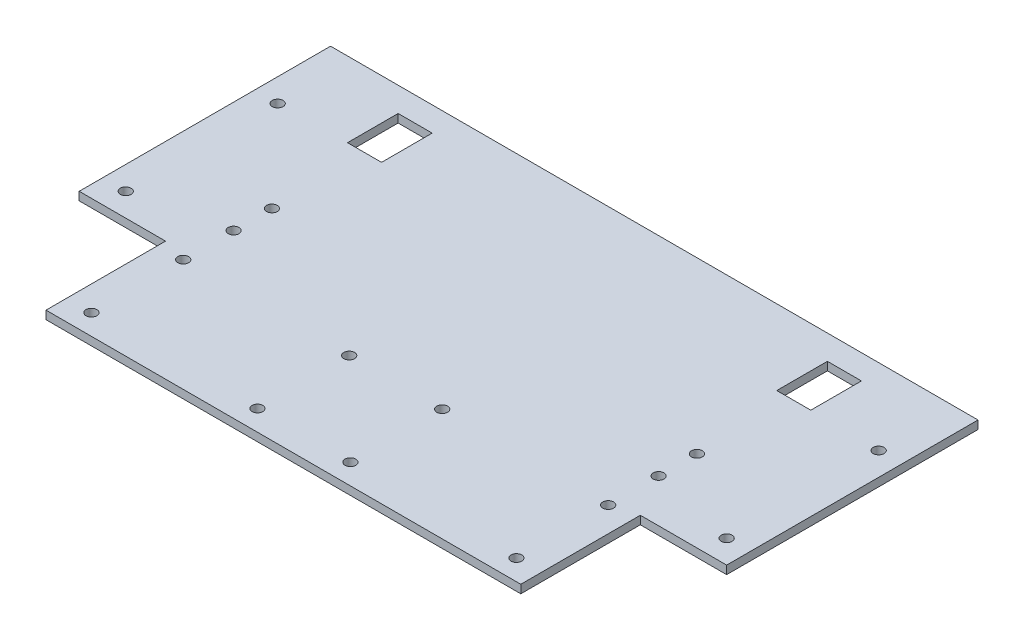
ISO-10303-21;
HEADER;
FILE_DESCRIPTION(('STEP AP214'),'2;1');
FILE_NAME('part.step','',(''),(''),'','','');
FILE_SCHEMA(('AUTOMOTIVE_DESIGN { 1 0 10303 214 1 1 1 1 }'));
ENDSEC;
DATA;
#1=APPLICATION_CONTEXT('core data for automotive mechanical design processes');
#2=APPLICATION_PROTOCOL_DEFINITION('international standard','automotive_design',2000,#1);
#3=PRODUCT_CONTEXT('',#1,'mechanical');
#4=PRODUCT('Part','Part','',(#3));
#5=PRODUCT_RELATED_PRODUCT_CATEGORY('part','',(#4));
#6=PRODUCT_DEFINITION_FORMATION('','',#4);
#7=PRODUCT_DEFINITION_CONTEXT('part definition',#1,'design');
#8=PRODUCT_DEFINITION('design','',#6,#7);
#9=PRODUCT_DEFINITION_SHAPE('','',#8);
#10=(LENGTH_UNIT() NAMED_UNIT(*) SI_UNIT(.MILLI.,.METRE.));
#11=(NAMED_UNIT(*) PLANE_ANGLE_UNIT() SI_UNIT($,.RADIAN.));
#12=(NAMED_UNIT(*) SI_UNIT($,.STERADIAN.) SOLID_ANGLE_UNIT());
#13=UNCERTAINTY_MEASURE_WITH_UNIT(LENGTH_MEASURE(1.E-05),#10,'distance_accuracy_value','');
#14=(GEOMETRIC_REPRESENTATION_CONTEXT(3) GLOBAL_UNCERTAINTY_ASSIGNED_CONTEXT((#13)) GLOBAL_UNIT_ASSIGNED_CONTEXT((#10,
#11,#12)) REPRESENTATION_CONTEXT('',''));
#15=CARTESIAN_POINT('',(0.,0.,0.));
#16=DIRECTION('',(0.,0.,1.));
#17=DIRECTION('',(1.,0.,0.));
#18=AXIS2_PLACEMENT_3D('',#15,#16,#17);
#19=CARTESIAN_POINT('',(-97.5,2.5,0.));
#20=DIRECTION('',(-1.,0.,0.));
#21=DIRECTION('',(0.,0.,1.));
#22=AXIS2_PLACEMENT_3D('',#19,#20,#21);
#23=PLANE('',#22);
#24=DIRECTION('',(0.,0.,-1.));
#25=VECTOR('',#24,1.);
#26=CARTESIAN_POINT('',(-97.5,0.,0.));
#27=LINE('',#26,#25);
#28=CARTESIAN_POINT('',(-97.5,0.,25.0000000000045));
#29=VERTEX_POINT('',#28);
#30=CARTESIAN_POINT('',(-97.5,0.,-50.6999999999954));
#31=VERTEX_POINT('',#30);
#32=EDGE_CURVE('E177',#29,#31,#27,.T.);
#33=ORIENTED_EDGE('',*,*,#32,.F.);
#34=DIRECTION('',(0.,-1.,0.));
#35=VECTOR('',#34,1.);
#36=CARTESIAN_POINT('',(-97.5,2.5,25.0000000000045));
#37=LINE('',#36,#35);
#38=CARTESIAN_POINT('',(-97.5,2.5,25.0000000000045));
#39=VERTEX_POINT('',#38);
#40=EDGE_CURVE('E11',#39,#29,#37,.T.);
#41=ORIENTED_EDGE('',*,*,#40,.F.);
#42=DIRECTION('',(0.,0.,-1.));
#43=VECTOR('',#42,1.);
#44=CARTESIAN_POINT('',(-97.5,2.5,0.));
#45=LINE('',#44,#43);
#46=CARTESIAN_POINT('',(-97.5,2.50000000000003,-50.6999999999954));
#47=VERTEX_POINT('',#46);
#48=EDGE_CURVE('E189',#39,#47,#45,.T.);
#49=ORIENTED_EDGE('',*,*,#48,.T.);
#50=DIRECTION('',(0.,-1.,0.));
#51=VECTOR('',#50,1.);
#52=CARTESIAN_POINT('',(-97.5,2.50000000000003,-50.6999999999954));
#53=LINE('',#52,#51);
#54=EDGE_CURVE('E159',#47,#31,#53,.T.);
#55=ORIENTED_EDGE('',*,*,#54,.T.);
#56=EDGE_LOOP('',(#33,#41,#49,#55));
#57=FACE_BOUND('',#56,.T.);
#58=ADVANCED_FACE('F35',(#57),#23,.T.);
#59=CARTESIAN_POINT('',(0.,2.5,25.0000000000045));
#60=DIRECTION('',(0.,0.,1.));
#61=DIRECTION('',(1.,0.,0.));
#62=AXIS2_PLACEMENT_3D('',#59,#60,#61);
#63=PLANE('',#62);
#64=DIRECTION('',(-1.,0.,0.));
#65=VECTOR('',#64,1.);
#66=CARTESIAN_POINT('',(0.,0.,25.0000000000045));
#67=LINE('',#66,#65);
#68=CARTESIAN_POINT('',(-71.5,0.,25.0000000000045));
#69=VERTEX_POINT('',#68);
#70=EDGE_CURVE('E180',#69,#29,#67,.T.);
#71=ORIENTED_EDGE('',*,*,#70,.F.);
#72=DIRECTION('',(0.,-1.,0.));
#73=VECTOR('',#72,1.);
#74=CARTESIAN_POINT('',(-71.5,2.5,25.0000000000045));
#75=LINE('',#74,#73);
#76=CARTESIAN_POINT('',(-71.5,2.5,25.0000000000045));
#77=VERTEX_POINT('',#76);
#78=EDGE_CURVE('E43',#77,#69,#75,.T.);
#79=ORIENTED_EDGE('',*,*,#78,.F.);
#80=DIRECTION('',(-1.,0.,0.));
#81=VECTOR('',#80,1.);
#82=CARTESIAN_POINT('',(0.,2.5,25.0000000000045));
#83=LINE('',#82,#81);
#84=EDGE_CURVE('E191',#77,#39,#83,.T.);
#85=ORIENTED_EDGE('',*,*,#84,.T.);
#86=ORIENTED_EDGE('',*,*,#40,.T.);
#87=EDGE_LOOP('',(#71,#79,#85,#86));
#88=FACE_BOUND('',#87,.T.);
#89=ADVANCED_FACE('F395',(#88),#63,.T.);
#90=CARTESIAN_POINT('',(-71.5,2.5,0.));
#91=DIRECTION('',(-1.,0.,0.));
#92=DIRECTION('',(0.,0.,1.));
#93=AXIS2_PLACEMENT_3D('',#90,#91,#92);
#94=PLANE('',#93);
#95=DIRECTION('',(0.,0.,-1.));
#96=VECTOR('',#95,1.);
#97=CARTESIAN_POINT('',(-71.5,0.,0.));
#98=LINE('',#97,#96);
#99=CARTESIAN_POINT('',(-71.5,0.,61.0000000000045));
#100=VERTEX_POINT('',#99);
#101=EDGE_CURVE('E213',#100,#69,#98,.T.);
#102=ORIENTED_EDGE('',*,*,#101,.F.);
#103=DIRECTION('',(0.,-1.,0.));
#104=VECTOR('',#103,1.);
#105=CARTESIAN_POINT('',(-71.5,2.5,61.0000000000045));
#106=LINE('',#105,#104);
#107=CARTESIAN_POINT('',(-71.5,2.5,61.0000000000045));
#108=VERTEX_POINT('',#107);
#109=EDGE_CURVE('E232',#108,#100,#106,.T.);
#110=ORIENTED_EDGE('',*,*,#109,.F.);
#111=DIRECTION('',(0.,0.,-1.));
#112=VECTOR('',#111,1.);
#113=CARTESIAN_POINT('',(-71.5,2.5,0.));
#114=LINE('',#113,#112);
#115=EDGE_CURVE('E195',#108,#77,#114,.T.);
#116=ORIENTED_EDGE('',*,*,#115,.T.);
#117=ORIENTED_EDGE('',*,*,#78,.T.);
#118=EDGE_LOOP('',(#102,#110,#116,#117));
#119=FACE_BOUND('',#118,.T.);
#120=ADVANCED_FACE('F392',(#119),#94,.T.);
#121=CARTESIAN_POINT('',(0.,2.5,61.0000000000045));
#122=DIRECTION('',(0.,0.,-1.));
#123=DIRECTION('',(-1.,0.,0.));
#124=AXIS2_PLACEMENT_3D('',#121,#122,#123);
#125=PLANE('',#124);
#126=DIRECTION('',(1.,0.,0.));
#127=VECTOR('',#126,1.);
#128=CARTESIAN_POINT('',(0.,0.,61.0000000000045));
#129=LINE('',#128,#127);
#130=CARTESIAN_POINT('',(71.5,0.,61.0000000000045));
#131=VERTEX_POINT('',#130);
#132=EDGE_CURVE('E216',#100,#131,#129,.T.);
#133=ORIENTED_EDGE('',*,*,#132,.T.);
#134=DIRECTION('',(0.,-1.,0.));
#135=VECTOR('',#134,1.);
#136=CARTESIAN_POINT('',(71.5,2.5,61.0000000000045));
#137=LINE('',#136,#135);
#138=CARTESIAN_POINT('',(71.5,2.5,61.0000000000045));
#139=VERTEX_POINT('',#138);
#140=EDGE_CURVE('E229',#139,#131,#137,.T.);
#141=ORIENTED_EDGE('',*,*,#140,.F.);
#142=DIRECTION('',(1.,0.,0.));
#143=VECTOR('',#142,1.);
#144=CARTESIAN_POINT('',(0.,2.5,61.0000000000045));
#145=LINE('',#144,#143);
#146=EDGE_CURVE('E198',#108,#139,#145,.T.);
#147=ORIENTED_EDGE('',*,*,#146,.F.);
#148=ORIENTED_EDGE('',*,*,#109,.T.);
#149=EDGE_LOOP('',(#133,#141,#147,#148));
#150=FACE_BOUND('',#149,.T.);
#151=ADVANCED_FACE('F389',(#150),#125,.F.);
#152=CARTESIAN_POINT('',(71.5,2.5,0.));
#153=DIRECTION('',(-1.,0.,0.));
#154=DIRECTION('',(0.,0.,1.));
#155=AXIS2_PLACEMENT_3D('',#152,#153,#154);
#156=PLANE('',#155);
#157=DIRECTION('',(0.,0.,-1.));
#158=VECTOR('',#157,1.);
#159=CARTESIAN_POINT('',(71.5,0.,0.));
#160=LINE('',#159,#158);
#161=CARTESIAN_POINT('',(71.5,0.,25.0000000000045));
#162=VERTEX_POINT('',#161);
#163=EDGE_CURVE('E218',#131,#162,#160,.T.);
#164=ORIENTED_EDGE('',*,*,#163,.T.);
#165=DIRECTION('',(0.,-1.,0.));
#166=VECTOR('',#165,1.);
#167=CARTESIAN_POINT('',(71.5,2.5,25.0000000000045));
#168=LINE('',#167,#166);
#169=CARTESIAN_POINT('',(71.5,2.5,25.0000000000045));
#170=VERTEX_POINT('',#169);
#171=EDGE_CURVE('E226',#170,#162,#168,.T.);
#172=ORIENTED_EDGE('',*,*,#171,.F.);
#173=DIRECTION('',(0.,0.,-1.));
#174=VECTOR('',#173,1.);
#175=CARTESIAN_POINT('',(71.5,2.5,0.));
#176=LINE('',#175,#174);
#177=EDGE_CURVE('E200',#139,#170,#176,.T.);
#178=ORIENTED_EDGE('',*,*,#177,.F.);
#179=ORIENTED_EDGE('',*,*,#140,.T.);
#180=EDGE_LOOP('',(#164,#172,#178,#179));
#181=FACE_BOUND('',#180,.T.);
#182=ADVANCED_FACE('F385',(#181),#156,.F.);
#183=CARTESIAN_POINT('',(0.,2.5,25.0000000000045));
#184=DIRECTION('',(0.,0.,-1.));
#185=DIRECTION('',(-1.,0.,0.));
#186=AXIS2_PLACEMENT_3D('',#183,#184,#185);
#187=PLANE('',#186);
#188=DIRECTION('',(1.,0.,0.));
#189=VECTOR('',#188,1.);
#190=CARTESIAN_POINT('',(0.,0.,25.0000000000045));
#191=LINE('',#190,#189);
#192=CARTESIAN_POINT('',(97.5,0.,25.0000000000045));
#193=VERTEX_POINT('',#192);
#194=EDGE_CURVE('E170',#162,#193,#191,.T.);
#195=ORIENTED_EDGE('',*,*,#194,.T.);
#196=DIRECTION('',(0.,-1.,0.));
#197=VECTOR('',#196,1.);
#198=CARTESIAN_POINT('',(97.5,2.5,25.0000000000045));
#199=LINE('',#198,#197);
#200=CARTESIAN_POINT('',(97.5,2.5,25.0000000000045));
#201=VERTEX_POINT('',#200);
#202=EDGE_CURVE('E166',#201,#193,#199,.T.);
#203=ORIENTED_EDGE('',*,*,#202,.F.);
#204=DIRECTION('',(1.,0.,0.));
#205=VECTOR('',#204,1.);
#206=CARTESIAN_POINT('',(0.,2.5,25.0000000000045));
#207=LINE('',#206,#205);
#208=EDGE_CURVE('E202',#170,#201,#207,.T.);
#209=ORIENTED_EDGE('',*,*,#208,.F.);
#210=ORIENTED_EDGE('',*,*,#171,.T.);
#211=EDGE_LOOP('',(#195,#203,#209,#210));
#212=FACE_BOUND('',#211,.T.);
#213=ADVANCED_FACE('F380',(#212),#187,.F.);
#214=CARTESIAN_POINT('',(90.5,2.5,18.0000000000045));
#215=DIRECTION('',(0.,-1.,0.));
#216=DIRECTION('',(0.,0.,-1.));
#217=AXIS2_PLACEMENT_3D('',#214,#215,#216);
#218=CYLINDRICAL_SURFACE('',#217,1.625);
#219=CARTESIAN_POINT('',(90.5,2.5,18.0000000000045));
#220=DIRECTION('',(0.,1.,0.));
#221=DIRECTION('',(0.,0.,1.));
#222=AXIS2_PLACEMENT_3D('',#219,#220,#221);
#223=CIRCLE('',#222,1.625);
#224=CARTESIAN_POINT('',(90.5,2.5,19.6250000000045));
#225=VERTEX_POINT('',#224);
#226=EDGE_CURVE('E206',#225,#225,#223,.T.);
#227=ORIENTED_EDGE('',*,*,#226,.T.);
#228=EDGE_LOOP('',(#227));
#229=FACE_BOUND('',#228,.T.);
#230=CARTESIAN_POINT('',(90.5,0.,18.0000000000045));
#231=DIRECTION('',(0.,1.,0.));
#232=DIRECTION('',(0.,0.,1.));
#233=AXIS2_PLACEMENT_3D('',#230,#231,#232);
#234=CIRCLE('',#233,1.625);
#235=CARTESIAN_POINT('',(90.5,0.,19.6250000000045));
#236=VERTEX_POINT('',#235);
#237=EDGE_CURVE('E169',#236,#236,#234,.T.);
#238=ORIENTED_EDGE('',*,*,#237,.F.);
#239=EDGE_LOOP('',(#238));
#240=FACE_BOUND('',#239,.T.);
#241=ADVANCED_FACE('F409',(#229,#240),#218,.F.);
#242=CARTESIAN_POINT('',(97.5,2.5,0.));
#243=DIRECTION('',(-1.,0.,0.));
#244=DIRECTION('',(0.,0.,1.));
#245=AXIS2_PLACEMENT_3D('',#242,#243,#244);
#246=PLANE('',#245);
#247=DIRECTION('',(0.,0.,-1.));
#248=VECTOR('',#247,1.);
#249=CARTESIAN_POINT('',(97.5,0.,0.));
#250=LINE('',#249,#248);
#251=CARTESIAN_POINT('',(97.5,0.,-50.6999999999954));
#252=VERTEX_POINT('',#251);
#253=EDGE_CURVE('E163',#193,#252,#250,.T.);
#254=ORIENTED_EDGE('',*,*,#253,.T.);
#255=DIRECTION('',(0.,-1.,0.));
#256=VECTOR('',#255,1.);
#257=CARTESIAN_POINT('',(97.5,2.50000000000003,-50.6999999999954));
#258=LINE('',#257,#256);
#259=CARTESIAN_POINT('',(97.5,2.50000000000003,-50.6999999999954));
#260=VERTEX_POINT('',#259);
#261=EDGE_CURVE('E148',#260,#252,#258,.T.);
#262=ORIENTED_EDGE('',*,*,#261,.F.);
#263=DIRECTION('',(0.,0.,-1.));
#264=VECTOR('',#263,1.);
#265=CARTESIAN_POINT('',(97.5,2.5,0.));
#266=LINE('',#265,#264);
#267=EDGE_CURVE('E204',#201,#260,#266,.T.);
#268=ORIENTED_EDGE('',*,*,#267,.F.);
#269=ORIENTED_EDGE('',*,*,#202,.T.);
#270=EDGE_LOOP('',(#254,#262,#268,#269));
#271=FACE_BOUND('',#270,.T.);
#272=ADVANCED_FACE('F164',(#271),#246,.F.);
#273=CARTESIAN_POINT('',(-90.5,2.5,18.0000000000045));
#274=DIRECTION('',(0.,-1.,0.));
#275=DIRECTION('',(0.,0.,-1.));
#276=AXIS2_PLACEMENT_3D('',#273,#274,#275);
#277=CYLINDRICAL_SURFACE('',#276,1.625);
#278=CARTESIAN_POINT('',(-90.5,2.5,18.0000000000045));
#279=DIRECTION('',(0.,1.,0.));
#280=DIRECTION('',(0.,0.,1.));
#281=AXIS2_PLACEMENT_3D('',#278,#279,#280);
#282=CIRCLE('',#281,1.625);
#283=CARTESIAN_POINT('',(-90.5,2.5,19.6250000000045));
#284=VERTEX_POINT('',#283);
#285=EDGE_CURVE('E209',#284,#284,#282,.F.);
#286=ORIENTED_EDGE('',*,*,#285,.F.);
#287=EDGE_LOOP('',(#286));
#288=FACE_BOUND('',#287,.T.);
#289=CARTESIAN_POINT('',(-90.5,0.,18.0000000000045));
#290=DIRECTION('',(0.,1.,0.));
#291=DIRECTION('',(0.,0.,1.));
#292=AXIS2_PLACEMENT_3D('',#289,#290,#291);
#293=CIRCLE('',#292,1.625);
#294=CARTESIAN_POINT('',(-90.5,0.,19.6250000000045));
#295=VERTEX_POINT('',#294);
#296=EDGE_CURVE('E192',#295,#295,#293,.F.);
#297=ORIENTED_EDGE('',*,*,#296,.T.);
#298=EDGE_LOOP('',(#297));
#299=FACE_BOUND('',#298,.T.);
#300=ADVANCED_FACE('F412',(#288,#299),#277,.F.);
#301=CARTESIAN_POINT('',(0.,2.5,0.));
#302=DIRECTION('',(0.,1.,0.));
#303=DIRECTION('',(0.,0.,1.));
#304=AXIS2_PLACEMENT_3D('',#301,#302,#303);
#305=PLANE('',#304);
#306=DIRECTION('',(0.,0.,-1.));
#307=VECTOR('',#306,1.);
#308=CARTESIAN_POINT('',(-59.5180736102201,2.5,0.));
#309=LINE('',#308,#307);
#310=CARTESIAN_POINT('',(-59.5180736102202,2.5,-28.0749999999954));
#311=VERTEX_POINT('',#310);
#312=CARTESIAN_POINT('',(-59.5180736102202,2.5,-43.3249999999954));
#313=VERTEX_POINT('',#312);
#314=EDGE_CURVE('E313',#311,#313,#309,.T.);
#315=ORIENTED_EDGE('',*,*,#314,.F.);
#316=DIRECTION('',(1.,0.,0.));
#317=VECTOR('',#316,1.);
#318=CARTESIAN_POINT('',(0.,2.5,-28.0749999999954));
#319=LINE('',#318,#317);
#320=CARTESIAN_POINT('',(-69.7680736102202,2.5,-28.0749999999954));
#321=VERTEX_POINT('',#320);
#322=EDGE_CURVE('E323',#321,#311,#319,.T.);
#323=ORIENTED_EDGE('',*,*,#322,.F.);
#324=DIRECTION('',(0.,0.,1.));
#325=VECTOR('',#324,1.);
#326=CARTESIAN_POINT('',(-69.7680736102202,2.5,0.));
#327=LINE('',#326,#325);
#328=CARTESIAN_POINT('',(-69.7680736102202,2.5,-43.3249999999954));
#329=VERTEX_POINT('',#328);
#330=EDGE_CURVE('E321',#329,#321,#327,.T.);
#331=ORIENTED_EDGE('',*,*,#330,.F.);
#332=DIRECTION('',(-1.,0.,0.));
#333=VECTOR('',#332,1.);
#334=CARTESIAN_POINT('',(0.,2.5,-43.3249999999954));
#335=LINE('',#334,#333);
#336=EDGE_CURVE('E319',#313,#329,#335,.T.);
#337=ORIENTED_EDGE('',*,*,#336,.F.);
#338=EDGE_LOOP('',(#315,#323,#331,#337));
#339=FACE_BOUND('',#338,.T.);
#340=DIRECTION('',(0.,0.,-1.));
#341=VECTOR('',#340,1.);
#342=CARTESIAN_POINT('',(69.7680736102202,2.5,0.));
#343=LINE('',#342,#341);
#344=CARTESIAN_POINT('',(69.7680736102202,2.5,-28.0749999999954));
#345=VERTEX_POINT('',#344);
#346=CARTESIAN_POINT('',(69.7680736102202,2.5,-43.3249999999954));
#347=VERTEX_POINT('',#346);
#348=EDGE_CURVE('E325',#345,#347,#343,.T.);
#349=ORIENTED_EDGE('',*,*,#348,.F.);
#350=DIRECTION('',(1.,0.,0.));
#351=VECTOR('',#350,1.);
#352=CARTESIAN_POINT('',(0.,2.5,-28.0749999999954));
#353=LINE('',#352,#351);
#354=CARTESIAN_POINT('',(59.5180736102202,2.5,-28.0749999999954));
#355=VERTEX_POINT('',#354);
#356=EDGE_CURVE('E331',#355,#345,#353,.T.);
#357=ORIENTED_EDGE('',*,*,#356,.F.);
#358=DIRECTION('',(0.,0.,1.));
#359=VECTOR('',#358,1.);
#360=CARTESIAN_POINT('',(59.5180736102201,2.5,0.));
#361=LINE('',#360,#359);
#362=CARTESIAN_POINT('',(59.5180736102202,2.5,-43.3249999999954));
#363=VERTEX_POINT('',#362);
#364=EDGE_CURVE('E329',#363,#355,#361,.T.);
#365=ORIENTED_EDGE('',*,*,#364,.F.);
#366=DIRECTION('',(-1.,0.,0.));
#367=VECTOR('',#366,1.);
#368=CARTESIAN_POINT('',(0.,2.5,-43.3249999999954));
#369=LINE('',#368,#367);
#370=EDGE_CURVE('E327',#347,#363,#369,.T.);
#371=ORIENTED_EDGE('',*,*,#370,.F.);
#372=EDGE_LOOP('',(#349,#357,#365,#371));
#373=FACE_BOUND('',#372,.T.);
#374=CARTESIAN_POINT('',(14.,2.5,27.1754000000041));
#375=DIRECTION('',(0.,-1.,0.));
#376=DIRECTION('',(0.,0.,-1.));
#377=AXIS2_PLACEMENT_3D('',#374,#375,#376);
#378=CIRCLE('',#377,1.625);
#379=CARTESIAN_POINT('',(14.,2.5,25.5504000000041));
#380=VERTEX_POINT('',#379);
#381=EDGE_CURVE('E297',#380,#380,#378,.T.);
#382=ORIENTED_EDGE('',*,*,#381,.T.);
#383=EDGE_LOOP('',(#382));
#384=FACE_BOUND('',#383,.T.);
#385=CARTESIAN_POINT('',(-64.,2.5,27.1754000000044));
#386=DIRECTION('',(0.,-1.,0.));
#387=DIRECTION('',(0.,0.,1.));
#388=AXIS2_PLACEMENT_3D('',#385,#386,#387);
#389=CIRCLE('',#388,1.625);
#390=CARTESIAN_POINT('',(-64.,2.5,28.8004000000044));
#391=VERTEX_POINT('',#390);
#392=EDGE_CURVE('E300',#391,#391,#389,.T.);
#393=ORIENTED_EDGE('',*,*,#392,.T.);
#394=EDGE_LOOP('',(#393));
#395=FACE_BOUND('',#394,.T.);
#396=CARTESIAN_POINT('',(-64.,2.5,54.8245000000044));
#397=DIRECTION('',(0.,-1.,0.));
#398=DIRECTION('',(0.,0.,1.));
#399=AXIS2_PLACEMENT_3D('',#396,#397,#398);
#400=CIRCLE('',#399,1.625);
#401=CARTESIAN_POINT('',(-64.,2.5,56.4495000000044));
#402=VERTEX_POINT('',#401);
#403=EDGE_CURVE('E304',#402,#402,#400,.T.);
#404=ORIENTED_EDGE('',*,*,#403,.T.);
#405=EDGE_LOOP('',(#404));
#406=FACE_BOUND('',#405,.T.);
#407=CARTESIAN_POINT('',(64.,2.5,54.8245000000045));
#408=DIRECTION('',(0.,-1.,0.));
#409=DIRECTION('',(0.,0.,-1.));
#410=AXIS2_PLACEMENT_3D('',#407,#408,#409);
#411=CIRCLE('',#410,1.625);
#412=CARTESIAN_POINT('',(64.,2.5,53.1995000000045));
#413=VERTEX_POINT('',#412);
#414=EDGE_CURVE('E289',#413,#413,#411,.T.);
#415=ORIENTED_EDGE('',*,*,#414,.T.);
#416=EDGE_LOOP('',(#415));
#417=FACE_BOUND('',#416,.T.);
#418=CARTESIAN_POINT('',(-64.,2.5,12.0000000000045));
#419=DIRECTION('',(0.,-1.,0.));
#420=DIRECTION('',(0.,0.,1.));
#421=AXIS2_PLACEMENT_3D('',#418,#419,#420);
#422=CIRCLE('',#421,1.625);
#423=CARTESIAN_POINT('',(-64.,2.5,13.6250000000045));
#424=VERTEX_POINT('',#423);
#425=EDGE_CURVE('E285',#424,#424,#422,.T.);
#426=ORIENTED_EDGE('',*,*,#425,.T.);
#427=EDGE_LOOP('',(#426));
#428=FACE_BOUND('',#427,.T.);
#429=CARTESIAN_POINT('',(-64.,2.5,0.460000000004494));
#430=DIRECTION('',(0.,-1.,0.));
#431=DIRECTION('',(0.,0.,1.));
#432=AXIS2_PLACEMENT_3D('',#429,#430,#431);
#433=CIRCLE('',#432,1.625);
#434=CARTESIAN_POINT('',(-64.,2.5,2.0850000000045));
#435=VERTEX_POINT('',#434);
#436=EDGE_CURVE('E288',#435,#435,#433,.T.);
#437=ORIENTED_EDGE('',*,*,#436,.T.);
#438=EDGE_LOOP('',(#437));
#439=FACE_BOUND('',#438,.T.);
#440=CARTESIAN_POINT('',(64.,2.5,27.1754000000045));
#441=DIRECTION('',(0.,-1.,0.));
#442=DIRECTION('',(0.,0.,-1.));
#443=AXIS2_PLACEMENT_3D('',#440,#441,#442);
#444=CIRCLE('',#443,1.625);
#445=CARTESIAN_POINT('',(64.,2.5,25.5504000000045));
#446=VERTEX_POINT('',#445);
#447=EDGE_CURVE('E292',#446,#446,#444,.T.);
#448=ORIENTED_EDGE('',*,*,#447,.T.);
#449=EDGE_LOOP('',(#448));
#450=FACE_BOUND('',#449,.T.);
#451=CARTESIAN_POINT('',(64.,2.5,12.0000000000045));
#452=DIRECTION('',(0.,-1.,0.));
#453=DIRECTION('',(0.,0.,-1.));
#454=AXIS2_PLACEMENT_3D('',#451,#452,#453);
#455=CIRCLE('',#454,1.625);
#456=CARTESIAN_POINT('',(64.,2.5,10.3750000000045));
#457=VERTEX_POINT('',#456);
#458=EDGE_CURVE('E284',#457,#457,#455,.T.);
#459=ORIENTED_EDGE('',*,*,#458,.T.);
#460=EDGE_LOOP('',(#459));
#461=FACE_BOUND('',#460,.T.);
#462=CARTESIAN_POINT('',(14.,2.5,54.8245000000042));
#463=DIRECTION('',(0.,-1.,0.));
#464=DIRECTION('',(0.,0.,-1.));
#465=AXIS2_PLACEMENT_3D('',#462,#463,#464);
#466=CIRCLE('',#465,1.625);
#467=CARTESIAN_POINT('',(14.,2.5,53.1995000000041));
#468=VERTEX_POINT('',#467);
#469=EDGE_CURVE('E301',#468,#468,#466,.T.);
#470=ORIENTED_EDGE('',*,*,#469,.T.);
#471=EDGE_LOOP('',(#470));
#472=FACE_BOUND('',#471,.T.);
#473=CARTESIAN_POINT('',(-14.,2.5,54.8245000000041));
#474=DIRECTION('',(0.,-1.,0.));
#475=DIRECTION('',(0.,0.,1.));
#476=AXIS2_PLACEMENT_3D('',#473,#474,#475);
#477=CIRCLE('',#476,1.625);
#478=CARTESIAN_POINT('',(-14.,2.5,56.4495000000041));
#479=VERTEX_POINT('',#478);
#480=EDGE_CURVE('E312',#479,#479,#477,.T.);
#481=ORIENTED_EDGE('',*,*,#480,.T.);
#482=EDGE_LOOP('',(#481));
#483=FACE_BOUND('',#482,.T.);
#484=CARTESIAN_POINT('',(-14.,2.5,27.1754000000041));
#485=DIRECTION('',(0.,-1.,0.));
#486=DIRECTION('',(0.,0.,1.));
#487=AXIS2_PLACEMENT_3D('',#484,#485,#486);
#488=CIRCLE('',#487,1.625);
#489=CARTESIAN_POINT('',(-14.,2.5,28.8004000000041));
#490=VERTEX_POINT('',#489);
#491=EDGE_CURVE('E309',#490,#490,#488,.T.);
#492=ORIENTED_EDGE('',*,*,#491,.T.);
#493=EDGE_LOOP('',(#492));
#494=FACE_BOUND('',#493,.T.);
#495=CARTESIAN_POINT('',(64.,2.5,0.460000000004494));
#496=DIRECTION('',(0.,-1.,0.));
#497=DIRECTION('',(0.,0.,-1.));
#498=AXIS2_PLACEMENT_3D('',#495,#496,#497);
#499=CIRCLE('',#498,1.625);
#500=CARTESIAN_POINT('',(64.,2.5,-1.16499999999551));
#501=VERTEX_POINT('',#500);
#502=EDGE_CURVE('E242',#501,#501,#499,.T.);
#503=ORIENTED_EDGE('',*,*,#502,.T.);
#504=EDGE_LOOP('',(#503));
#505=FACE_BOUND('',#504,.T.);
#506=CARTESIAN_POINT('',(90.5000000000001,2.5,-27.7831999517202));
#507=DIRECTION('',(0.,1.,0.));
#508=DIRECTION('',(0.,0.,1.));
#509=AXIS2_PLACEMENT_3D('',#506,#507,#508);
#510=CIRCLE('',#509,1.625);
#511=CARTESIAN_POINT('',(90.5000000000001,2.5,-26.1581999517202));
#512=VERTEX_POINT('',#511);
#513=EDGE_CURVE('E236',#512,#512,#510,.T.);
#514=ORIENTED_EDGE('',*,*,#513,.F.);
#515=EDGE_LOOP('',(#514));
#516=FACE_BOUND('',#515,.T.);
#517=CARTESIAN_POINT('',(-90.5000000000001,2.5,-27.7831999517202));
#518=DIRECTION('',(0.,1.,0.));
#519=DIRECTION('',(0.,0.,-1.));
#520=AXIS2_PLACEMENT_3D('',#517,#518,#519);
#521=CIRCLE('',#520,1.625);
#522=CARTESIAN_POINT('',(-90.5000000000001,2.5,-29.4081999517202));
#523=VERTEX_POINT('',#522);
#524=EDGE_CURVE('E187',#523,#523,#521,.T.);
#525=ORIENTED_EDGE('',*,*,#524,.F.);
#526=EDGE_LOOP('',(#525));
#527=FACE_BOUND('',#526,.T.);
#528=ORIENTED_EDGE('',*,*,#267,.T.);
#529=DIRECTION('',(-1.,0.,0.));
#530=VECTOR('',#529,1.);
#531=CARTESIAN_POINT('',(97.5,2.50000000000003,-50.6999999999954));
#532=LINE('',#531,#530);
#533=EDGE_CURVE('E156',#260,#47,#532,.T.);
#534=ORIENTED_EDGE('',*,*,#533,.T.);
#535=ORIENTED_EDGE('',*,*,#48,.F.);
#536=ORIENTED_EDGE('',*,*,#84,.F.);
#537=ORIENTED_EDGE('',*,*,#115,.F.);
#538=ORIENTED_EDGE('',*,*,#146,.T.);
#539=ORIENTED_EDGE('',*,*,#177,.T.);
#540=ORIENTED_EDGE('',*,*,#208,.T.);
#541=EDGE_LOOP('',(#528,#534,#535,#536,#537,#538,#539,#540));
#542=FACE_BOUND('',#541,.T.);
#543=ORIENTED_EDGE('',*,*,#226,.F.);
#544=EDGE_LOOP('',(#543));
#545=FACE_BOUND('',#544,.T.);
#546=ORIENTED_EDGE('',*,*,#285,.T.);
#547=EDGE_LOOP('',(#546));
#548=FACE_BOUND('',#547,.T.);
#549=ADVANCED_FACE('F374',(#339,#373,#384,#395,#406,#417,#428,#439,#450,#461,#472,#483,#494,
#505,#516,#527,#542,#545,#548),#305,.T.);
#550=CARTESIAN_POINT('',(0.,0.,0.));
#551=DIRECTION('',(0.,1.,0.));
#552=DIRECTION('',(0.,0.,1.));
#553=AXIS2_PLACEMENT_3D('',#550,#551,#552);
#554=PLANE('',#553);
#555=DIRECTION('',(-1.,0.,0.));
#556=VECTOR('',#555,1.);
#557=CARTESIAN_POINT('',(-69.7680736102202,0.,-28.0749999999954));
#558=LINE('',#557,#556);
#559=CARTESIAN_POINT('',(-59.5180736102202,0.,-28.0749999999954));
#560=VERTEX_POINT('',#559);
#561=CARTESIAN_POINT('',(-69.7680736102202,0.,-28.0749999999954));
#562=VERTEX_POINT('',#561);
#563=EDGE_CURVE('E366',#560,#562,#558,.T.);
#564=ORIENTED_EDGE('',*,*,#563,.F.);
#565=DIRECTION('',(0.,0.,1.));
#566=VECTOR('',#565,1.);
#567=CARTESIAN_POINT('',(-59.5180736102202,0.,-28.0749999999954));
#568=LINE('',#567,#566);
#569=CARTESIAN_POINT('',(-59.5180736102202,0.,-43.3249999999954));
#570=VERTEX_POINT('',#569);
#571=EDGE_CURVE('E343',#570,#560,#568,.T.);
#572=ORIENTED_EDGE('',*,*,#571,.F.);
#573=DIRECTION('',(1.,0.,0.));
#574=VECTOR('',#573,1.);
#575=CARTESIAN_POINT('',(-69.7680736102202,0.,-43.3249999999954));
#576=LINE('',#575,#574);
#577=CARTESIAN_POINT('',(-69.7680736102202,0.,-43.3249999999954));
#578=VERTEX_POINT('',#577);
#579=EDGE_CURVE('E356',#578,#570,#576,.T.);
#580=ORIENTED_EDGE('',*,*,#579,.F.);
#581=DIRECTION('',(0.,0.,-1.));
#582=VECTOR('',#581,1.);
#583=CARTESIAN_POINT('',(-69.7680736102202,0.,-28.0749999999954));
#584=LINE('',#583,#582);
#585=EDGE_CURVE('E363',#562,#578,#584,.T.);
#586=ORIENTED_EDGE('',*,*,#585,.F.);
#587=EDGE_LOOP('',(#564,#572,#580,#586));
#588=FACE_BOUND('',#587,.T.);
#589=DIRECTION('',(-1.,0.,0.));
#590=VECTOR('',#589,1.);
#591=CARTESIAN_POINT('',(69.7680736102202,0.,-28.0749999999954));
#592=LINE('',#591,#590);
#593=CARTESIAN_POINT('',(69.7680736102202,0.,-28.0749999999954));
#594=VERTEX_POINT('',#593);
#595=CARTESIAN_POINT('',(59.5180736102202,0.,-28.0749999999954));
#596=VERTEX_POINT('',#595);
#597=EDGE_CURVE('E349',#594,#596,#592,.T.);
#598=ORIENTED_EDGE('',*,*,#597,.F.);
#599=DIRECTION('',(0.,0.,1.));
#600=VECTOR('',#599,1.);
#601=CARTESIAN_POINT('',(69.7680736102202,0.,-28.0749999999954));
#602=LINE('',#601,#600);
#603=CARTESIAN_POINT('',(69.7680736102202,0.,-43.3249999999954));
#604=VERTEX_POINT('',#603);
#605=EDGE_CURVE('E351',#604,#594,#602,.T.);
#606=ORIENTED_EDGE('',*,*,#605,.F.);
#607=DIRECTION('',(1.,0.,0.));
#608=VECTOR('',#607,1.);
#609=CARTESIAN_POINT('',(69.7680736102202,0.,-43.3249999999954));
#610=LINE('',#609,#608);
#611=CARTESIAN_POINT('',(59.5180736102202,0.,-43.3249999999954));
#612=VERTEX_POINT('',#611);
#613=EDGE_CURVE('E337',#612,#604,#610,.T.);
#614=ORIENTED_EDGE('',*,*,#613,.F.);
#615=DIRECTION('',(0.,0.,-1.));
#616=VECTOR('',#615,1.);
#617=CARTESIAN_POINT('',(59.5180736102202,0.,-28.0749999999954));
#618=LINE('',#617,#616);
#619=EDGE_CURVE('E346',#596,#612,#618,.T.);
#620=ORIENTED_EDGE('',*,*,#619,.F.);
#621=EDGE_LOOP('',(#598,#606,#614,#620));
#622=FACE_BOUND('',#621,.T.);
#623=CARTESIAN_POINT('',(14.,0.,27.1754000000041));
#624=DIRECTION('',(0.,1.,0.));
#625=DIRECTION('',(0.,0.,1.));
#626=AXIS2_PLACEMENT_3D('',#623,#624,#625);
#627=CIRCLE('',#626,1.625);
#628=CARTESIAN_POINT('',(14.,0.,28.8004000000041));
#629=VERTEX_POINT('',#628);
#630=EDGE_CURVE('E38',#629,#629,#627,.F.);
#631=ORIENTED_EDGE('',*,*,#630,.F.);
#632=EDGE_LOOP('',(#631));
#633=FACE_BOUND('',#632,.T.);
#634=CARTESIAN_POINT('',(-64.,0.,27.1754000000044));
#635=DIRECTION('',(0.,1.,0.));
#636=DIRECTION('',(0.,0.,1.));
#637=AXIS2_PLACEMENT_3D('',#634,#635,#636);
#638=CIRCLE('',#637,1.625);
#639=CARTESIAN_POINT('',(-64.,0.,28.8004000000044));
#640=VERTEX_POINT('',#639);
#641=EDGE_CURVE('E268',#640,#640,#638,.F.);
#642=ORIENTED_EDGE('',*,*,#641,.F.);
#643=EDGE_LOOP('',(#642));
#644=FACE_BOUND('',#643,.T.);
#645=CARTESIAN_POINT('',(-64.,0.,54.8245000000044));
#646=DIRECTION('',(0.,1.,0.));
#647=DIRECTION('',(0.,0.,1.));
#648=AXIS2_PLACEMENT_3D('',#645,#646,#647);
#649=CIRCLE('',#648,1.625);
#650=CARTESIAN_POINT('',(-64.,0.,56.4495000000044));
#651=VERTEX_POINT('',#650);
#652=EDGE_CURVE('E266',#651,#651,#649,.F.);
#653=ORIENTED_EDGE('',*,*,#652,.F.);
#654=EDGE_LOOP('',(#653));
#655=FACE_BOUND('',#654,.T.);
#656=CARTESIAN_POINT('',(64.,0.,54.8245000000045));
#657=DIRECTION('',(0.,1.,0.));
#658=DIRECTION('',(0.,0.,1.));
#659=AXIS2_PLACEMENT_3D('',#656,#657,#658);
#660=CIRCLE('',#659,1.625);
#661=CARTESIAN_POINT('',(64.,0.,56.4495000000045));
#662=VERTEX_POINT('',#661);
#663=EDGE_CURVE('E263',#662,#662,#660,.F.);
#664=ORIENTED_EDGE('',*,*,#663,.F.);
#665=EDGE_LOOP('',(#664));
#666=FACE_BOUND('',#665,.T.);
#667=CARTESIAN_POINT('',(-64.,0.,12.0000000000045));
#668=DIRECTION('',(0.,1.,0.));
#669=DIRECTION('',(0.,0.,1.));
#670=AXIS2_PLACEMENT_3D('',#667,#668,#669);
#671=CIRCLE('',#670,1.625);
#672=CARTESIAN_POINT('',(-64.,0.,13.6250000000045));
#673=VERTEX_POINT('',#672);
#674=EDGE_CURVE('E260',#673,#673,#671,.F.);
#675=ORIENTED_EDGE('',*,*,#674,.F.);
#676=EDGE_LOOP('',(#675));
#677=FACE_BOUND('',#676,.T.);
#678=CARTESIAN_POINT('',(-64.,0.,0.460000000004494));
#679=DIRECTION('',(0.,1.,0.));
#680=DIRECTION('',(0.,0.,1.));
#681=AXIS2_PLACEMENT_3D('',#678,#679,#680);
#682=CIRCLE('',#681,1.625);
#683=CARTESIAN_POINT('',(-64.,0.,2.0850000000045));
#684=VERTEX_POINT('',#683);
#685=EDGE_CURVE('E257',#684,#684,#682,.F.);
#686=ORIENTED_EDGE('',*,*,#685,.F.);
#687=EDGE_LOOP('',(#686));
#688=FACE_BOUND('',#687,.T.);
#689=CARTESIAN_POINT('',(64.,0.,27.1754000000045));
#690=DIRECTION('',(0.,1.,0.));
#691=DIRECTION('',(0.,0.,1.));
#692=AXIS2_PLACEMENT_3D('',#689,#690,#691);
#693=CIRCLE('',#692,1.625);
#694=CARTESIAN_POINT('',(64.,0.,28.8004000000045));
#695=VERTEX_POINT('',#694);
#696=EDGE_CURVE('E254',#695,#695,#693,.F.);
#697=ORIENTED_EDGE('',*,*,#696,.F.);
#698=EDGE_LOOP('',(#697));
#699=FACE_BOUND('',#698,.T.);
#700=CARTESIAN_POINT('',(64.,0.,12.0000000000045));
#701=DIRECTION('',(0.,1.,0.));
#702=DIRECTION('',(0.,0.,1.));
#703=AXIS2_PLACEMENT_3D('',#700,#701,#702);
#704=CIRCLE('',#703,1.625);
#705=CARTESIAN_POINT('',(64.,0.,13.6250000000045));
#706=VERTEX_POINT('',#705);
#707=EDGE_CURVE('E251',#706,#706,#704,.F.);
#708=ORIENTED_EDGE('',*,*,#707,.F.);
#709=EDGE_LOOP('',(#708));
#710=FACE_BOUND('',#709,.T.);
#711=CARTESIAN_POINT('',(14.,0.,54.8245000000042));
#712=DIRECTION('',(0.,1.,0.));
#713=DIRECTION('',(0.,0.,1.));
#714=AXIS2_PLACEMENT_3D('',#711,#712,#713);
#715=CIRCLE('',#714,1.625);
#716=CARTESIAN_POINT('',(14.,0.,56.4495000000042));
#717=VERTEX_POINT('',#716);
#718=EDGE_CURVE('E248',#717,#717,#715,.F.);
#719=ORIENTED_EDGE('',*,*,#718,.F.);
#720=EDGE_LOOP('',(#719));
#721=FACE_BOUND('',#720,.T.);
#722=CARTESIAN_POINT('',(-14.,0.,54.8245000000041));
#723=DIRECTION('',(0.,1.,0.));
#724=DIRECTION('',(0.,0.,1.));
#725=AXIS2_PLACEMENT_3D('',#722,#723,#724);
#726=CIRCLE('',#725,1.625);
#727=CARTESIAN_POINT('',(-14.,0.,56.4495000000041));
#728=VERTEX_POINT('',#727);
#729=EDGE_CURVE('E245',#728,#728,#726,.F.);
#730=ORIENTED_EDGE('',*,*,#729,.F.);
#731=EDGE_LOOP('',(#730));
#732=FACE_BOUND('',#731,.T.);
#733=CARTESIAN_POINT('',(-14.,0.,27.1754000000041));
#734=DIRECTION('',(0.,1.,0.));
#735=DIRECTION('',(0.,0.,1.));
#736=AXIS2_PLACEMENT_3D('',#733,#734,#735);
#737=CIRCLE('',#736,1.625);
#738=CARTESIAN_POINT('',(-14.,0.,28.8004000000041));
#739=VERTEX_POINT('',#738);
#740=EDGE_CURVE('E241',#739,#739,#737,.F.);
#741=ORIENTED_EDGE('',*,*,#740,.F.);
#742=EDGE_LOOP('',(#741));
#743=FACE_BOUND('',#742,.T.);
#744=CARTESIAN_POINT('',(64.,0.,0.460000000004494));
#745=DIRECTION('',(0.,1.,0.));
#746=DIRECTION('',(0.,0.,1.));
#747=AXIS2_PLACEMENT_3D('',#744,#745,#746);
#748=CIRCLE('',#747,1.625);
#749=CARTESIAN_POINT('',(64.,0.,2.0850000000045));
#750=VERTEX_POINT('',#749);
#751=EDGE_CURVE('E238',#750,#750,#748,.F.);
#752=ORIENTED_EDGE('',*,*,#751,.F.);
#753=EDGE_LOOP('',(#752));
#754=FACE_BOUND('',#753,.T.);
#755=CARTESIAN_POINT('',(90.5000000000001,0.,-27.7831999517202));
#756=DIRECTION('',(0.,1.,0.));
#757=DIRECTION('',(0.,0.,1.));
#758=AXIS2_PLACEMENT_3D('',#755,#756,#757);
#759=CIRCLE('',#758,1.625);
#760=CARTESIAN_POINT('',(90.5000000000001,0.,-26.1581999517202));
#761=VERTEX_POINT('',#760);
#762=EDGE_CURVE('E178',#761,#761,#759,.T.);
#763=ORIENTED_EDGE('',*,*,#762,.T.);
#764=EDGE_LOOP('',(#763));
#765=FACE_BOUND('',#764,.T.);
#766=CARTESIAN_POINT('',(-90.5000000000001,0.,-27.7831999517202));
#767=DIRECTION('',(0.,1.,0.));
#768=DIRECTION('',(0.,0.,1.));
#769=AXIS2_PLACEMENT_3D('',#766,#767,#768);
#770=CIRCLE('',#769,1.625);
#771=CARTESIAN_POINT('',(-90.5000000000001,0.,-26.1581999517202));
#772=VERTEX_POINT('',#771);
#773=EDGE_CURVE('E183',#772,#772,#770,.T.);
#774=ORIENTED_EDGE('',*,*,#773,.T.);
#775=EDGE_LOOP('',(#774));
#776=FACE_BOUND('',#775,.T.);
#777=ORIENTED_EDGE('',*,*,#32,.T.);
#778=DIRECTION('',(1.,0.,0.));
#779=VECTOR('',#778,1.);
#780=CARTESIAN_POINT('',(-142.5693909433,0.,-50.6999999999953));
#781=LINE('',#780,#779);
#782=EDGE_CURVE('E153',#31,#252,#781,.T.);
#783=ORIENTED_EDGE('',*,*,#782,.T.);
#784=ORIENTED_EDGE('',*,*,#253,.F.);
#785=ORIENTED_EDGE('',*,*,#194,.F.);
#786=ORIENTED_EDGE('',*,*,#163,.F.);
#787=ORIENTED_EDGE('',*,*,#132,.F.);
#788=ORIENTED_EDGE('',*,*,#101,.T.);
#789=ORIENTED_EDGE('',*,*,#70,.T.);
#790=EDGE_LOOP('',(#777,#783,#784,#785,#786,#787,#788,#789));
#791=FACE_BOUND('',#790,.T.);
#792=ORIENTED_EDGE('',*,*,#237,.T.);
#793=EDGE_LOOP('',(#792));
#794=FACE_BOUND('',#793,.T.);
#795=ORIENTED_EDGE('',*,*,#296,.F.);
#796=EDGE_LOOP('',(#795));
#797=FACE_BOUND('',#796,.T.);
#798=ADVANCED_FACE('F173',(#588,#622,#633,#644,#655,#666,#677,#688,#699,#710,#721,#732,#743,
#754,#765,#776,#791,#794,#797),#554,.F.);
#799=CARTESIAN_POINT('',(-90.5000000000001,-7.5,-27.7831999517202));
#800=DIRECTION('',(0.,1.,0.));
#801=DIRECTION('',(0.,0.,1.));
#802=AXIS2_PLACEMENT_3D('',#799,#800,#801);
#803=CYLINDRICAL_SURFACE('',#802,1.625);
#804=ORIENTED_EDGE('',*,*,#524,.T.);
#805=EDGE_LOOP('',(#804));
#806=FACE_BOUND('',#805,.T.);
#807=ORIENTED_EDGE('',*,*,#773,.F.);
#808=EDGE_LOOP('',(#807));
#809=FACE_BOUND('',#808,.T.);
#810=ADVANCED_FACE('F421',(#806,#809),#803,.F.);
#811=CARTESIAN_POINT('',(90.5000000000001,-7.5,-27.7831999517202));
#812=DIRECTION('',(0.,1.,0.));
#813=DIRECTION('',(0.,0.,1.));
#814=AXIS2_PLACEMENT_3D('',#811,#812,#813);
#815=CYLINDRICAL_SURFACE('',#814,1.625);
#816=ORIENTED_EDGE('',*,*,#513,.T.);
#817=EDGE_LOOP('',(#816));
#818=FACE_BOUND('',#817,.T.);
#819=ORIENTED_EDGE('',*,*,#762,.F.);
#820=EDGE_LOOP('',(#819));
#821=FACE_BOUND('',#820,.T.);
#822=ADVANCED_FACE('F428',(#818,#821),#815,.F.);
#823=CARTESIAN_POINT('',(64.,-7.5,0.460000000004494));
#824=DIRECTION('',(0.,1.,0.));
#825=DIRECTION('',(0.,0.,1.));
#826=AXIS2_PLACEMENT_3D('',#823,#824,#825);
#827=CYLINDRICAL_SURFACE('',#826,1.625);
#828=ORIENTED_EDGE('',*,*,#502,.F.);
#829=EDGE_LOOP('',(#828));
#830=FACE_BOUND('',#829,.T.);
#831=ORIENTED_EDGE('',*,*,#751,.T.);
#832=EDGE_LOOP('',(#831));
#833=FACE_BOUND('',#832,.T.);
#834=ADVANCED_FACE('F431',(#830,#833),#827,.F.);
#835=CARTESIAN_POINT('',(-14.,-7.5,27.1754000000041));
#836=DIRECTION('',(0.,1.,0.));
#837=DIRECTION('',(0.,0.,1.));
#838=AXIS2_PLACEMENT_3D('',#835,#836,#837);
#839=CYLINDRICAL_SURFACE('',#838,1.625);
#840=ORIENTED_EDGE('',*,*,#491,.F.);
#841=EDGE_LOOP('',(#840));
#842=FACE_BOUND('',#841,.T.);
#843=ORIENTED_EDGE('',*,*,#740,.T.);
#844=EDGE_LOOP('',(#843));
#845=FACE_BOUND('',#844,.T.);
#846=ADVANCED_FACE('F434',(#842,#845),#839,.F.);
#847=CARTESIAN_POINT('',(-14.,-7.5,54.8245000000041));
#848=DIRECTION('',(0.,1.,0.));
#849=DIRECTION('',(0.,0.,1.));
#850=AXIS2_PLACEMENT_3D('',#847,#848,#849);
#851=CYLINDRICAL_SURFACE('',#850,1.625);
#852=ORIENTED_EDGE('',*,*,#480,.F.);
#853=EDGE_LOOP('',(#852));
#854=FACE_BOUND('',#853,.T.);
#855=ORIENTED_EDGE('',*,*,#729,.T.);
#856=EDGE_LOOP('',(#855));
#857=FACE_BOUND('',#856,.T.);
#858=ADVANCED_FACE('F472',(#854,#857),#851,.F.);
#859=CARTESIAN_POINT('',(14.,-7.5,54.8245000000042));
#860=DIRECTION('',(0.,1.,0.));
#861=DIRECTION('',(0.,0.,1.));
#862=AXIS2_PLACEMENT_3D('',#859,#860,#861);
#863=CYLINDRICAL_SURFACE('',#862,1.625);
#864=ORIENTED_EDGE('',*,*,#469,.F.);
#865=EDGE_LOOP('',(#864));
#866=FACE_BOUND('',#865,.T.);
#867=ORIENTED_EDGE('',*,*,#718,.T.);
#868=EDGE_LOOP('',(#867));
#869=FACE_BOUND('',#868,.T.);
#870=ADVANCED_FACE('F452',(#866,#869),#863,.F.);
#871=CARTESIAN_POINT('',(64.,-7.5,12.0000000000045));
#872=DIRECTION('',(0.,1.,0.));
#873=DIRECTION('',(0.,0.,1.));
#874=AXIS2_PLACEMENT_3D('',#871,#872,#873);
#875=CYLINDRICAL_SURFACE('',#874,1.625);
#876=ORIENTED_EDGE('',*,*,#458,.F.);
#877=EDGE_LOOP('',(#876));
#878=FACE_BOUND('',#877,.T.);
#879=ORIENTED_EDGE('',*,*,#707,.T.);
#880=EDGE_LOOP('',(#879));
#881=FACE_BOUND('',#880,.T.);
#882=ADVANCED_FACE('F448',(#878,#881),#875,.F.);
#883=CARTESIAN_POINT('',(64.,-7.5,27.1754000000045));
#884=DIRECTION('',(0.,1.,0.));
#885=DIRECTION('',(0.,0.,1.));
#886=AXIS2_PLACEMENT_3D('',#883,#884,#885);
#887=CYLINDRICAL_SURFACE('',#886,1.625);
#888=ORIENTED_EDGE('',*,*,#447,.F.);
#889=EDGE_LOOP('',(#888));
#890=FACE_BOUND('',#889,.T.);
#891=ORIENTED_EDGE('',*,*,#696,.T.);
#892=EDGE_LOOP('',(#891));
#893=FACE_BOUND('',#892,.T.);
#894=ADVANCED_FACE('F444',(#890,#893),#887,.F.);
#895=CARTESIAN_POINT('',(-64.,-7.5,0.460000000004494));
#896=DIRECTION('',(0.,1.,0.));
#897=DIRECTION('',(0.,0.,1.));
#898=AXIS2_PLACEMENT_3D('',#895,#896,#897);
#899=CYLINDRICAL_SURFACE('',#898,1.625);
#900=ORIENTED_EDGE('',*,*,#436,.F.);
#901=EDGE_LOOP('',(#900));
#902=FACE_BOUND('',#901,.T.);
#903=ORIENTED_EDGE('',*,*,#685,.T.);
#904=EDGE_LOOP('',(#903));
#905=FACE_BOUND('',#904,.T.);
#906=ADVANCED_FACE('F440',(#902,#905),#899,.F.);
#907=CARTESIAN_POINT('',(-64.,-7.5,12.0000000000045));
#908=DIRECTION('',(0.,1.,0.));
#909=DIRECTION('',(0.,0.,1.));
#910=AXIS2_PLACEMENT_3D('',#907,#908,#909);
#911=CYLINDRICAL_SURFACE('',#910,1.625);
#912=ORIENTED_EDGE('',*,*,#425,.F.);
#913=EDGE_LOOP('',(#912));
#914=FACE_BOUND('',#913,.T.);
#915=ORIENTED_EDGE('',*,*,#674,.T.);
#916=EDGE_LOOP('',(#915));
#917=FACE_BOUND('',#916,.T.);
#918=ADVANCED_FACE('F436',(#914,#917),#911,.F.);
#919=CARTESIAN_POINT('',(64.,-7.5,54.8245000000045));
#920=DIRECTION('',(0.,1.,0.));
#921=DIRECTION('',(0.,0.,1.));
#922=AXIS2_PLACEMENT_3D('',#919,#920,#921);
#923=CYLINDRICAL_SURFACE('',#922,1.625);
#924=ORIENTED_EDGE('',*,*,#414,.F.);
#925=EDGE_LOOP('',(#924));
#926=FACE_BOUND('',#925,.T.);
#927=ORIENTED_EDGE('',*,*,#663,.T.);
#928=EDGE_LOOP('',(#927));
#929=FACE_BOUND('',#928,.T.);
#930=ADVANCED_FACE('F439',(#926,#929),#923,.F.);
#931=CARTESIAN_POINT('',(-64.,-7.5,54.8245000000044));
#932=DIRECTION('',(0.,1.,0.));
#933=DIRECTION('',(0.,0.,1.));
#934=AXIS2_PLACEMENT_3D('',#931,#932,#933);
#935=CYLINDRICAL_SURFACE('',#934,1.625);
#936=ORIENTED_EDGE('',*,*,#403,.F.);
#937=EDGE_LOOP('',(#936));
#938=FACE_BOUND('',#937,.T.);
#939=ORIENTED_EDGE('',*,*,#652,.T.);
#940=EDGE_LOOP('',(#939));
#941=FACE_BOUND('',#940,.T.);
#942=ADVANCED_FACE('F462',(#938,#941),#935,.F.);
#943=CARTESIAN_POINT('',(-64.,-7.5,27.1754000000044));
#944=DIRECTION('',(0.,1.,0.));
#945=DIRECTION('',(0.,0.,1.));
#946=AXIS2_PLACEMENT_3D('',#943,#944,#945);
#947=CYLINDRICAL_SURFACE('',#946,1.625);
#948=ORIENTED_EDGE('',*,*,#392,.F.);
#949=EDGE_LOOP('',(#948));
#950=FACE_BOUND('',#949,.T.);
#951=ORIENTED_EDGE('',*,*,#641,.T.);
#952=EDGE_LOOP('',(#951));
#953=FACE_BOUND('',#952,.T.);
#954=ADVANCED_FACE('F458',(#950,#953),#947,.F.);
#955=CARTESIAN_POINT('',(14.,-7.5,27.1754000000041));
#956=DIRECTION('',(0.,1.,0.));
#957=DIRECTION('',(0.,0.,1.));
#958=AXIS2_PLACEMENT_3D('',#955,#956,#957);
#959=CYLINDRICAL_SURFACE('',#958,1.625);
#960=ORIENTED_EDGE('',*,*,#381,.F.);
#961=EDGE_LOOP('',(#960));
#962=FACE_BOUND('',#961,.T.);
#963=ORIENTED_EDGE('',*,*,#630,.T.);
#964=EDGE_LOOP('',(#963));
#965=FACE_BOUND('',#964,.T.);
#966=ADVANCED_FACE('F454',(#962,#965),#959,.F.);
#967=CARTESIAN_POINT('',(69.7680736102202,10.,-28.0749999999954));
#968=DIRECTION('',(1.,0.,0.));
#969=DIRECTION('',(0.,0.,-1.));
#970=AXIS2_PLACEMENT_3D('',#967,#968,#969);
#971=PLANE('',#970);
#972=ORIENTED_EDGE('',*,*,#348,.T.);
#973=DIRECTION('',(0.,-1.,0.));
#974=VECTOR('',#973,1.);
#975=CARTESIAN_POINT('',(69.7680736102202,10.,-43.3249999999954));
#976=LINE('',#975,#974);
#977=EDGE_CURVE('E341',#347,#604,#976,.T.);
#978=ORIENTED_EDGE('',*,*,#977,.T.);
#979=ORIENTED_EDGE('',*,*,#605,.T.);
#980=DIRECTION('',(0.,-1.,0.));
#981=VECTOR('',#980,1.);
#982=CARTESIAN_POINT('',(69.7680736102202,10.,-28.0749999999954));
#983=LINE('',#982,#981);
#984=EDGE_CURVE('E334',#345,#594,#983,.T.);
#985=ORIENTED_EDGE('',*,*,#984,.F.);
#986=EDGE_LOOP('',(#972,#978,#979,#985));
#987=FACE_BOUND('',#986,.T.);
#988=ADVANCED_FACE('F457',(#987),#971,.F.);
#989=CARTESIAN_POINT('',(69.7680736102202,10.,-43.3249999999954));
#990=DIRECTION('',(0.,0.,-1.));
#991=DIRECTION('',(-1.,0.,0.));
#992=AXIS2_PLACEMENT_3D('',#989,#990,#991);
#993=PLANE('',#992);
#994=ORIENTED_EDGE('',*,*,#370,.T.);
#995=DIRECTION('',(0.,-1.,0.));
#996=VECTOR('',#995,1.);
#997=CARTESIAN_POINT('',(59.5180736102202,10.,-43.3249999999954));
#998=LINE('',#997,#996);
#999=EDGE_CURVE('E339',#363,#612,#998,.T.);
#1000=ORIENTED_EDGE('',*,*,#999,.T.);
#1001=ORIENTED_EDGE('',*,*,#613,.T.);
#1002=ORIENTED_EDGE('',*,*,#977,.F.);
#1003=EDGE_LOOP('',(#994,#1000,#1001,#1002));
#1004=FACE_BOUND('',#1003,.T.);
#1005=ADVANCED_FACE('F482',(#1004),#993,.F.);
#1006=CARTESIAN_POINT('',(59.5180736102202,10.,-28.0749999999954));
#1007=DIRECTION('',(-1.,0.,0.));
#1008=DIRECTION('',(0.,0.,1.));
#1009=AXIS2_PLACEMENT_3D('',#1006,#1007,#1008);
#1010=PLANE('',#1009);
#1011=ORIENTED_EDGE('',*,*,#364,.T.);
#1012=DIRECTION('',(0.,-1.,0.));
#1013=VECTOR('',#1012,1.);
#1014=CARTESIAN_POINT('',(59.5180736102202,10.,-28.0749999999954));
#1015=LINE('',#1014,#1013);
#1016=EDGE_CURVE('E59',#355,#596,#1015,.T.);
#1017=ORIENTED_EDGE('',*,*,#1016,.T.);
#1018=ORIENTED_EDGE('',*,*,#619,.T.);
#1019=ORIENTED_EDGE('',*,*,#999,.F.);
#1020=EDGE_LOOP('',(#1011,#1017,#1018,#1019));
#1021=FACE_BOUND('',#1020,.T.);
#1022=ADVANCED_FACE('F488',(#1021),#1010,.F.);
#1023=CARTESIAN_POINT('',(69.7680736102202,10.,-28.0749999999954));
#1024=DIRECTION('',(0.,0.,1.));
#1025=DIRECTION('',(1.,0.,0.));
#1026=AXIS2_PLACEMENT_3D('',#1023,#1024,#1025);
#1027=PLANE('',#1026);
#1028=ORIENTED_EDGE('',*,*,#356,.T.);
#1029=ORIENTED_EDGE('',*,*,#984,.T.);
#1030=ORIENTED_EDGE('',*,*,#597,.T.);
#1031=ORIENTED_EDGE('',*,*,#1016,.F.);
#1032=EDGE_LOOP('',(#1028,#1029,#1030,#1031));
#1033=FACE_BOUND('',#1032,.T.);
#1034=ADVANCED_FACE('F484',(#1033),#1027,.F.);
#1035=CARTESIAN_POINT('',(-59.5180736102202,10.,-28.0749999999954));
#1036=DIRECTION('',(1.,0.,0.));
#1037=DIRECTION('',(0.,0.,-1.));
#1038=AXIS2_PLACEMENT_3D('',#1035,#1036,#1037);
#1039=PLANE('',#1038);
#1040=ORIENTED_EDGE('',*,*,#314,.T.);
#1041=DIRECTION('',(0.,-1.,0.));
#1042=VECTOR('',#1041,1.);
#1043=CARTESIAN_POINT('',(-59.5180736102202,10.,-43.3249999999954));
#1044=LINE('',#1043,#1042);
#1045=EDGE_CURVE('E333',#313,#570,#1044,.T.);
#1046=ORIENTED_EDGE('',*,*,#1045,.T.);
#1047=ORIENTED_EDGE('',*,*,#571,.T.);
#1048=DIRECTION('',(0.,-1.,0.));
#1049=VECTOR('',#1048,1.);
#1050=CARTESIAN_POINT('',(-59.5180736102202,10.,-28.0749999999954));
#1051=LINE('',#1050,#1049);
#1052=EDGE_CURVE('E353',#311,#560,#1051,.T.);
#1053=ORIENTED_EDGE('',*,*,#1052,.F.);
#1054=EDGE_LOOP('',(#1040,#1046,#1047,#1053));
#1055=FACE_BOUND('',#1054,.T.);
#1056=ADVANCED_FACE('F487',(#1055),#1039,.F.);
#1057=CARTESIAN_POINT('',(-69.7680736102202,10.,-43.3249999999954));
#1058=DIRECTION('',(0.,0.,-1.));
#1059=DIRECTION('',(-1.,0.,0.));
#1060=AXIS2_PLACEMENT_3D('',#1057,#1058,#1059);
#1061=PLANE('',#1060);
#1062=ORIENTED_EDGE('',*,*,#336,.T.);
#1063=DIRECTION('',(0.,-1.,0.));
#1064=VECTOR('',#1063,1.);
#1065=CARTESIAN_POINT('',(-69.7680736102202,10.,-43.3249999999954));
#1066=LINE('',#1065,#1064);
#1067=EDGE_CURVE('E358',#329,#578,#1066,.T.);
#1068=ORIENTED_EDGE('',*,*,#1067,.T.);
#1069=ORIENTED_EDGE('',*,*,#579,.T.);
#1070=ORIENTED_EDGE('',*,*,#1045,.F.);
#1071=EDGE_LOOP('',(#1062,#1068,#1069,#1070));
#1072=FACE_BOUND('',#1071,.T.);
#1073=ADVANCED_FACE('F497',(#1072),#1061,.F.);
#1074=CARTESIAN_POINT('',(-69.7680736102202,10.,-28.0749999999954));
#1075=DIRECTION('',(-1.,0.,0.));
#1076=DIRECTION('',(0.,0.,1.));
#1077=AXIS2_PLACEMENT_3D('',#1074,#1075,#1076);
#1078=PLANE('',#1077);
#1079=ORIENTED_EDGE('',*,*,#330,.T.);
#1080=DIRECTION('',(0.,-1.,0.));
#1081=VECTOR('',#1080,1.);
#1082=CARTESIAN_POINT('',(-69.7680736102202,10.,-28.0749999999954));
#1083=LINE('',#1082,#1081);
#1084=EDGE_CURVE('E51',#321,#562,#1083,.T.);
#1085=ORIENTED_EDGE('',*,*,#1084,.T.);
#1086=ORIENTED_EDGE('',*,*,#585,.T.);
#1087=ORIENTED_EDGE('',*,*,#1067,.F.);
#1088=EDGE_LOOP('',(#1079,#1085,#1086,#1087));
#1089=FACE_BOUND('',#1088,.T.);
#1090=ADVANCED_FACE('F502',(#1089),#1078,.F.);
#1091=CARTESIAN_POINT('',(-69.7680736102202,10.,-28.0749999999954));
#1092=DIRECTION('',(0.,0.,1.));
#1093=DIRECTION('',(1.,0.,0.));
#1094=AXIS2_PLACEMENT_3D('',#1091,#1092,#1093);
#1095=PLANE('',#1094);
#1096=ORIENTED_EDGE('',*,*,#322,.T.);
#1097=ORIENTED_EDGE('',*,*,#1052,.T.);
#1098=ORIENTED_EDGE('',*,*,#563,.T.);
#1099=ORIENTED_EDGE('',*,*,#1084,.F.);
#1100=EDGE_LOOP('',(#1096,#1097,#1098,#1099));
#1101=FACE_BOUND('',#1100,.T.);
#1102=ADVANCED_FACE('F499',(#1101),#1095,.F.);
#1103=CARTESIAN_POINT('',(97.5,2.50000000000003,-50.6999999999954));
#1104=DIRECTION('',(0.,0.,-1.));
#1105=DIRECTION('',(-1.,0.,0.));
#1106=AXIS2_PLACEMENT_3D('',#1103,#1104,#1105);
#1107=PLANE('',#1106);
#1108=ORIENTED_EDGE('',*,*,#54,.F.);
#1109=ORIENTED_EDGE('',*,*,#533,.F.);
#1110=ORIENTED_EDGE('',*,*,#261,.T.);
#1111=ORIENTED_EDGE('',*,*,#782,.F.);
#1112=EDGE_LOOP('',(#1108,#1109,#1110,#1111));
#1113=FACE_BOUND('',#1112,.T.);
#1114=ADVANCED_FACE('F151',(#1113),#1107,.T.);
#1115=CLOSED_SHELL('',(#58,#89,#120,#151,#182,#213,#241,#272,#300,#549,#798,#810,#822,#834,#846,
#858,#870,#882,#894,#906,#918,#930,#942,#954,#966,#988,#1005,#1022,#1034,#1056,#1073,#1090,
#1102,#1114));
#1116=MANIFOLD_SOLID_BREP('B2',#1115);
#1117=ADVANCED_BREP_SHAPE_REPRESENTATION('',(#18,#1116),#14);
#1118=SHAPE_DEFINITION_REPRESENTATION(#9,#1117);
ENDSEC;
END-ISO-10303-21;
